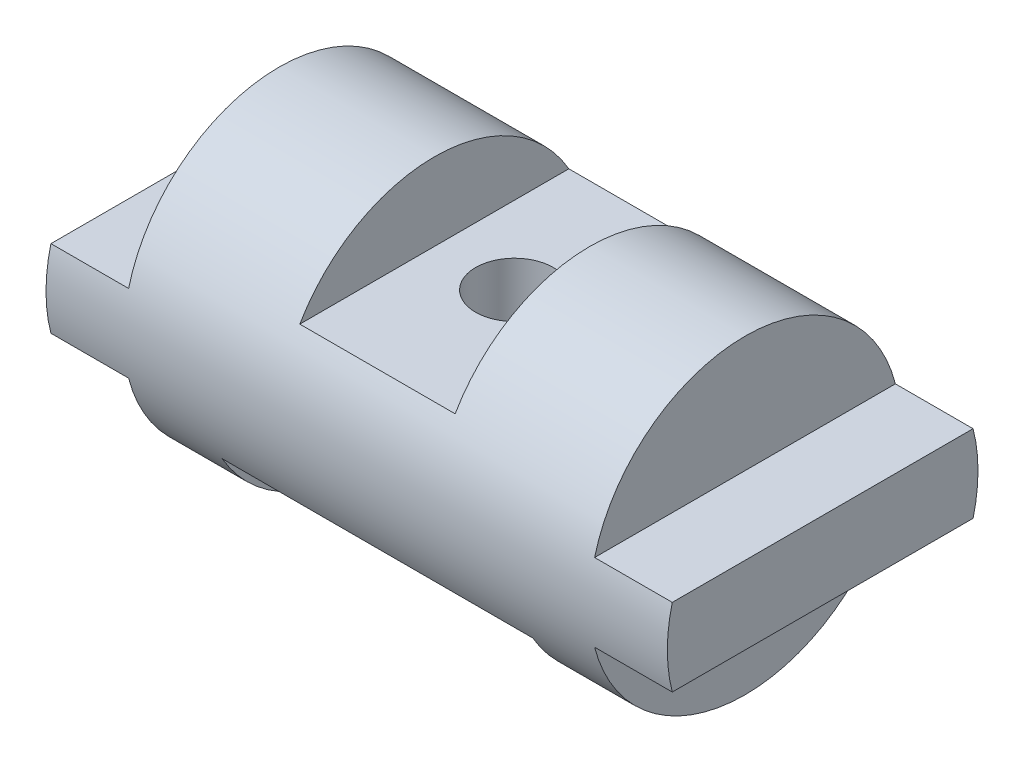
ISO-10303-21;
HEADER;
FILE_DESCRIPTION(('STEP AP214'),'2;1');
FILE_NAME('part.step','',(''),(''),'','','');
FILE_SCHEMA(('AUTOMOTIVE_DESIGN { 1 0 10303 214 1 1 1 1 }'));
ENDSEC;
DATA;
#1=APPLICATION_CONTEXT('core data for automotive mechanical design processes');
#2=APPLICATION_PROTOCOL_DEFINITION('international standard','automotive_design',2000,#1);
#3=PRODUCT_CONTEXT('',#1,'mechanical');
#4=PRODUCT('Part','Part','',(#3));
#5=PRODUCT_RELATED_PRODUCT_CATEGORY('part','',(#4));
#6=PRODUCT_DEFINITION_FORMATION('','',#4);
#7=PRODUCT_DEFINITION_CONTEXT('part definition',#1,'design');
#8=PRODUCT_DEFINITION('design','',#6,#7);
#9=PRODUCT_DEFINITION_SHAPE('','',#8);
#10=(LENGTH_UNIT() NAMED_UNIT(*) SI_UNIT(.MILLI.,.METRE.));
#11=(NAMED_UNIT(*) PLANE_ANGLE_UNIT() SI_UNIT($,.RADIAN.));
#12=(NAMED_UNIT(*) SI_UNIT($,.STERADIAN.) SOLID_ANGLE_UNIT());
#13=UNCERTAINTY_MEASURE_WITH_UNIT(LENGTH_MEASURE(1.E-05),#10,'distance_accuracy_value','');
#14=(GEOMETRIC_REPRESENTATION_CONTEXT(3) GLOBAL_UNCERTAINTY_ASSIGNED_CONTEXT((#13)) GLOBAL_UNIT_ASSIGNED_CONTEXT((#10,
#11,#12)) REPRESENTATION_CONTEXT('',''));
#15=CARTESIAN_POINT('',(0.,0.,0.));
#16=DIRECTION('',(0.,0.,1.));
#17=DIRECTION('',(1.,0.,0.));
#18=AXIS2_PLACEMENT_3D('',#15,#16,#17);
#19=CARTESIAN_POINT('',(30.,20.,20.001));
#20=DIRECTION('',(1.,0.,0.));
#21=DIRECTION('',(0.,0.,-1.));
#22=AXIS2_PLACEMENT_3D('',#19,#20,#21);
#23=PLANE('',#22);
#24=DIRECTION('',(0.,0.,-1.));
#25=VECTOR('',#24,1.);
#26=CARTESIAN_POINT('',(30.,10.,20.001));
#27=LINE('',#26,#25);
#28=CARTESIAN_POINT('',(30.,10.,17.3205080756888));
#29=VERTEX_POINT('',#28);
#30=CARTESIAN_POINT('',(30.,10.,-17.3205080756888));
#31=VERTEX_POINT('',#30);
#32=EDGE_CURVE('E210',#29,#31,#27,.T.);
#33=ORIENTED_EDGE('',*,*,#32,.T.);
#34=CARTESIAN_POINT('',(30.,0.,0.));
#35=DIRECTION('',(1.,0.,0.));
#36=DIRECTION('',(0.,0.,-1.));
#37=AXIS2_PLACEMENT_3D('',#34,#35,#36);
#38=CIRCLE('',#37,20.);
#39=EDGE_CURVE('E205',#29,#31,#38,.F.);
#40=ORIENTED_EDGE('',*,*,#39,.F.);
#41=EDGE_LOOP('',(#33,#40));
#42=FACE_BOUND('',#41,.T.);
#43=ADVANCED_FACE('F33',(#42),#23,.T.);
#44=CARTESIAN_POINT('',(30.,10.,20.001));
#45=DIRECTION('',(0.,1.,0.));
#46=DIRECTION('',(-1.,0.,0.));
#47=AXIS2_PLACEMENT_3D('',#44,#45,#46);
#48=PLANE('',#47);
#49=CARTESIAN_POINT('',(40.,10.,-0.320508075688761));
#50=DIRECTION('',(0.,1.,0.));
#51=DIRECTION('',(-1.,0.,0.));
#52=AXIS2_PLACEMENT_3D('',#49,#50,#51);
#53=CIRCLE('',#52,5.);
#54=CARTESIAN_POINT('',(35.,10.,-0.320508075688761));
#55=VERTEX_POINT('',#54);
#56=EDGE_CURVE('E138',#55,#55,#53,.T.);
#57=ORIENTED_EDGE('',*,*,#56,.F.);
#58=EDGE_LOOP('',(#57));
#59=FACE_BOUND('',#58,.T.);
#60=DIRECTION('',(0.,0.,-1.));
#61=VECTOR('',#60,1.);
#62=CARTESIAN_POINT('',(50.,10.,20.001));
#63=LINE('',#62,#61);
#64=CARTESIAN_POINT('',(50.,10.,17.3205080756888));
#65=VERTEX_POINT('',#64);
#66=CARTESIAN_POINT('',(50.,10.,-17.3205080756888));
#67=VERTEX_POINT('',#66);
#68=EDGE_CURVE('E208',#65,#67,#63,.T.);
#69=ORIENTED_EDGE('',*,*,#68,.T.);
#70=DIRECTION('',(-1.,0.,0.));
#71=VECTOR('',#70,1.);
#72=CARTESIAN_POINT('',(80.,10.,-17.3205080756888));
#73=LINE('',#72,#71);
#74=EDGE_CURVE('E161',#67,#31,#73,.T.);
#75=ORIENTED_EDGE('',*,*,#74,.T.);
#76=ORIENTED_EDGE('',*,*,#32,.F.);
#77=DIRECTION('',(-1.,0.,0.));
#78=VECTOR('',#77,1.);
#79=CARTESIAN_POINT('',(80.,10.,17.3205080756888));
#80=LINE('',#79,#78);
#81=EDGE_CURVE('E57',#65,#29,#80,.T.);
#82=ORIENTED_EDGE('',*,*,#81,.F.);
#83=EDGE_LOOP('',(#69,#75,#76,#82));
#84=FACE_BOUND('',#83,.T.);
#85=ADVANCED_FACE('F245',(#59,#84),#48,.T.);
#86=CARTESIAN_POINT('',(50.,10.,20.001));
#87=DIRECTION('',(-1.,0.,0.));
#88=DIRECTION('',(0.,-1.,0.));
#89=AXIS2_PLACEMENT_3D('',#86,#87,#88);
#90=PLANE('',#89);
#91=ORIENTED_EDGE('',*,*,#68,.F.);
#92=CARTESIAN_POINT('',(50.,0.,0.));
#93=DIRECTION('',(-1.,0.,0.));
#94=DIRECTION('',(0.,-1.,0.));
#95=AXIS2_PLACEMENT_3D('',#92,#93,#94);
#96=CIRCLE('',#95,20.);
#97=EDGE_CURVE('E201',#67,#65,#96,.F.);
#98=ORIENTED_EDGE('',*,*,#97,.F.);
#99=EDGE_LOOP('',(#91,#98));
#100=FACE_BOUND('',#99,.T.);
#101=ADVANCED_FACE('F251',(#100),#90,.T.);
#102=CARTESIAN_POINT('',(80.,0.,0.));
#103=DIRECTION('',(-1.,0.,0.));
#104=DIRECTION('',(0.,0.,1.));
#105=AXIS2_PLACEMENT_3D('',#102,#103,#104);
#106=CYLINDRICAL_SURFACE('',#105,20.);
#107=ORIENTED_EDGE('',*,*,#39,.T.);
#108=ORIENTED_EDGE('',*,*,#74,.F.);
#109=ORIENTED_EDGE('',*,*,#97,.T.);
#110=ORIENTED_EDGE('',*,*,#81,.T.);
#111=EDGE_LOOP('',(#107,#108,#109,#110));
#112=FACE_BOUND('',#111,.T.);
#113=CARTESIAN_POINT('',(60.,0.,0.));
#114=DIRECTION('',(-1.,0.,0.));
#115=DIRECTION('',(0.,-1.,0.));
#116=AXIS2_PLACEMENT_3D('',#113,#114,#115);
#117=CIRCLE('',#116,20.);
#118=CARTESIAN_POINT('',(60.,-9.99999999999999,17.3205080756888));
#119=VERTEX_POINT('',#118);
#120=CARTESIAN_POINT('',(60.,-9.99999999999999,-17.3205080756888));
#121=VERTEX_POINT('',#120);
#122=EDGE_CURVE('E128',#119,#121,#117,.F.);
#123=ORIENTED_EDGE('',*,*,#122,.T.);
#124=DIRECTION('',(-1.,0.,0.));
#125=VECTOR('',#124,1.);
#126=CARTESIAN_POINT('',(80.,-9.99999999999999,-17.3205080756888));
#127=LINE('',#126,#125);
#128=CARTESIAN_POINT('',(20.,-9.99999999999999,-17.3205080756888));
#129=VERTEX_POINT('',#128);
#130=EDGE_CURVE('E133',#129,#121,#127,.F.);
#131=ORIENTED_EDGE('',*,*,#130,.F.);
#132=CARTESIAN_POINT('',(20.,0.,0.));
#133=DIRECTION('',(1.,0.,0.));
#134=DIRECTION('',(0.,0.,-1.));
#135=AXIS2_PLACEMENT_3D('',#132,#133,#134);
#136=CIRCLE('',#135,20.);
#137=CARTESIAN_POINT('',(20.,-10.,17.3205080756888));
#138=VERTEX_POINT('',#137);
#139=EDGE_CURVE('E137',#129,#138,#136,.F.);
#140=ORIENTED_EDGE('',*,*,#139,.T.);
#141=DIRECTION('',(-1.,0.,0.));
#142=VECTOR('',#141,1.);
#143=CARTESIAN_POINT('',(80.,-9.99999999999999,17.3205080756888));
#144=LINE('',#143,#142);
#145=EDGE_CURVE('E49',#138,#119,#144,.F.);
#146=ORIENTED_EDGE('',*,*,#145,.T.);
#147=EDGE_LOOP('',(#123,#131,#140,#146));
#148=FACE_BOUND('',#147,.T.);
#149=DIRECTION('',(-1.,0.,0.));
#150=VECTOR('',#149,1.);
#151=CARTESIAN_POINT('',(80.,5.,-19.3649167310371));
#152=LINE('',#151,#150);
#153=CARTESIAN_POINT('',(80.,5.,-19.3649167310371));
#154=VERTEX_POINT('',#153);
#155=CARTESIAN_POINT('',(70.,5.,-19.3649167310371));
#156=VERTEX_POINT('',#155);
#157=EDGE_CURVE('E175',#154,#156,#152,.T.);
#158=ORIENTED_EDGE('',*,*,#157,.F.);
#159=CARTESIAN_POINT('',(80.,0.,0.));
#160=DIRECTION('',(1.,0.,0.));
#161=DIRECTION('',(0.,0.,-1.));
#162=AXIS2_PLACEMENT_3D('',#159,#160,#161);
#163=CIRCLE('',#162,20.);
#164=CARTESIAN_POINT('',(80.,-5.,-19.3649167310371));
#165=VERTEX_POINT('',#164);
#166=EDGE_CURVE('E42',#165,#154,#163,.T.);
#167=ORIENTED_EDGE('',*,*,#166,.F.);
#168=DIRECTION('',(-1.,0.,0.));
#169=VECTOR('',#168,1.);
#170=CARTESIAN_POINT('',(80.,-5.,-19.3649167310371));
#171=LINE('',#170,#169);
#172=CARTESIAN_POINT('',(70.,-5.,-19.3649167310371));
#173=VERTEX_POINT('',#172);
#174=EDGE_CURVE('E129',#173,#165,#171,.F.);
#175=ORIENTED_EDGE('',*,*,#174,.F.);
#176=CARTESIAN_POINT('',(70.,0.,0.));
#177=DIRECTION('',(1.,0.,0.));
#178=DIRECTION('',(0.,0.,-1.));
#179=AXIS2_PLACEMENT_3D('',#176,#177,#178);
#180=CIRCLE('',#179,20.);
#181=CARTESIAN_POINT('',(70.,-5.,19.3649167310371));
#182=VERTEX_POINT('',#181);
#183=EDGE_CURVE('E189',#173,#182,#180,.F.);
#184=ORIENTED_EDGE('',*,*,#183,.T.);
#185=DIRECTION('',(-1.,0.,0.));
#186=VECTOR('',#185,1.);
#187=CARTESIAN_POINT('',(80.,-5.,19.3649167310371));
#188=LINE('',#187,#186);
#189=CARTESIAN_POINT('',(80.,-5.,19.3649167310371));
#190=VERTEX_POINT('',#189);
#191=EDGE_CURVE('E192',#182,#190,#188,.F.);
#192=ORIENTED_EDGE('',*,*,#191,.T.);
#193=CARTESIAN_POINT('',(80.,5.,19.3649167310371));
#194=VERTEX_POINT('',#193);
#195=EDGE_CURVE('E11',#194,#190,#163,.T.);
#196=ORIENTED_EDGE('',*,*,#195,.F.);
#197=DIRECTION('',(-1.,0.,0.));
#198=VECTOR('',#197,1.);
#199=CARTESIAN_POINT('',(80.,5.,19.3649167310371));
#200=LINE('',#199,#198);
#201=CARTESIAN_POINT('',(70.,5.,19.3649167310371));
#202=VERTEX_POINT('',#201);
#203=EDGE_CURVE('E182',#194,#202,#200,.T.);
#204=ORIENTED_EDGE('',*,*,#203,.T.);
#205=CARTESIAN_POINT('',(70.,0.,0.));
#206=DIRECTION('',(1.,0.,0.));
#207=DIRECTION('',(0.,0.,-1.));
#208=AXIS2_PLACEMENT_3D('',#205,#206,#207);
#209=CIRCLE('',#208,20.);
#210=EDGE_CURVE('E178',#202,#156,#209,.F.);
#211=ORIENTED_EDGE('',*,*,#210,.T.);
#212=EDGE_LOOP('',(#158,#167,#175,#184,#192,#196,#204,#211));
#213=FACE_BOUND('',#212,.T.);
#214=DIRECTION('',(-1.,0.,0.));
#215=VECTOR('',#214,1.);
#216=CARTESIAN_POINT('',(80.,5.,-19.3649167310371));
#217=LINE('',#216,#215);
#218=CARTESIAN_POINT('',(9.99999999999999,5.,-19.3649167310371));
#219=VERTEX_POINT('',#218);
#220=CARTESIAN_POINT('',(0.,5.,-19.3649167310371));
#221=VERTEX_POINT('',#220);
#222=EDGE_CURVE('E146',#219,#221,#217,.T.);
#223=ORIENTED_EDGE('',*,*,#222,.F.);
#224=CARTESIAN_POINT('',(9.99999999999999,0.,0.));
#225=DIRECTION('',(-1.,0.,0.));
#226=DIRECTION('',(0.,0.,1.));
#227=AXIS2_PLACEMENT_3D('',#224,#225,#226);
#228=CIRCLE('',#227,20.);
#229=CARTESIAN_POINT('',(9.99999999999999,5.,19.3649167310371));
#230=VERTEX_POINT('',#229);
#231=EDGE_CURVE('E148',#219,#230,#228,.F.);
#232=ORIENTED_EDGE('',*,*,#231,.T.);
#233=DIRECTION('',(-1.,0.,0.));
#234=VECTOR('',#233,1.);
#235=CARTESIAN_POINT('',(80.,5.,19.3649167310371));
#236=LINE('',#235,#234);
#237=CARTESIAN_POINT('',(0.,5.,19.3649167310371));
#238=VERTEX_POINT('',#237);
#239=EDGE_CURVE('E152',#230,#238,#236,.T.);
#240=ORIENTED_EDGE('',*,*,#239,.T.);
#241=CARTESIAN_POINT('',(0.,0.,0.));
#242=DIRECTION('',(1.,0.,0.));
#243=DIRECTION('',(0.,0.,-1.));
#244=AXIS2_PLACEMENT_3D('',#241,#242,#243);
#245=CIRCLE('',#244,20.);
#246=CARTESIAN_POINT('',(0.,-5.,19.3649167310371));
#247=VERTEX_POINT('',#246);
#248=EDGE_CURVE('E212',#238,#247,#245,.T.);
#249=ORIENTED_EDGE('',*,*,#248,.T.);
#250=DIRECTION('',(-1.,0.,0.));
#251=VECTOR('',#250,1.);
#252=CARTESIAN_POINT('',(80.,-5.,19.3649167310371));
#253=LINE('',#252,#251);
#254=CARTESIAN_POINT('',(10.,-5.,19.3649167310371));
#255=VERTEX_POINT('',#254);
#256=EDGE_CURVE('E169',#247,#255,#253,.F.);
#257=ORIENTED_EDGE('',*,*,#256,.T.);
#258=CARTESIAN_POINT('',(9.99999999999999,0.,0.));
#259=DIRECTION('',(-1.,0.,0.));
#260=DIRECTION('',(0.,-1.,0.));
#261=AXIS2_PLACEMENT_3D('',#258,#259,#260);
#262=CIRCLE('',#261,20.);
#263=CARTESIAN_POINT('',(9.99999999999999,-5.,-19.3649167310371));
#264=VERTEX_POINT('',#263);
#265=EDGE_CURVE('E165',#255,#264,#262,.F.);
#266=ORIENTED_EDGE('',*,*,#265,.T.);
#267=DIRECTION('',(-1.,0.,0.));
#268=VECTOR('',#267,1.);
#269=CARTESIAN_POINT('',(80.,-5.,-19.3649167310371));
#270=LINE('',#269,#268);
#271=CARTESIAN_POINT('',(0.,-5.,-19.3649167310371));
#272=VERTEX_POINT('',#271);
#273=EDGE_CURVE('E162',#272,#264,#270,.F.);
#274=ORIENTED_EDGE('',*,*,#273,.F.);
#275=EDGE_CURVE('E37',#272,#221,#245,.T.);
#276=ORIENTED_EDGE('',*,*,#275,.T.);
#277=EDGE_LOOP('',(#223,#232,#240,#249,#257,#266,#274,#276));
#278=FACE_BOUND('',#277,.T.);
#279=ADVANCED_FACE('F35',(#112,#148,#213,#278),#106,.T.);
#280=CARTESIAN_POINT('',(80.,0.,0.));
#281=DIRECTION('',(1.,0.,0.));
#282=DIRECTION('',(0.,0.,-1.));
#283=AXIS2_PLACEMENT_3D('',#280,#281,#282);
#284=PLANE('',#283);
#285=ORIENTED_EDGE('',*,*,#166,.T.);
#286=DIRECTION('',(0.,0.,-1.));
#287=VECTOR('',#286,1.);
#288=CARTESIAN_POINT('',(80.,5.,20.001));
#289=LINE('',#288,#287);
#290=EDGE_CURVE('E185',#194,#154,#289,.T.);
#291=ORIENTED_EDGE('',*,*,#290,.F.);
#292=ORIENTED_EDGE('',*,*,#195,.T.);
#293=DIRECTION('',(0.,0.,-1.));
#294=VECTOR('',#293,1.);
#295=CARTESIAN_POINT('',(80.,-5.,20.001));
#296=LINE('',#295,#294);
#297=EDGE_CURVE('E179',#190,#165,#296,.T.);
#298=ORIENTED_EDGE('',*,*,#297,.T.);
#299=EDGE_LOOP('',(#285,#291,#292,#298));
#300=FACE_BOUND('',#299,.T.);
#301=ADVANCED_FACE('F256',(#300),#284,.T.);
#302=CARTESIAN_POINT('',(0.,0.,0.));
#303=DIRECTION('',(1.,0.,0.));
#304=DIRECTION('',(0.,0.,-1.));
#305=AXIS2_PLACEMENT_3D('',#302,#303,#304);
#306=PLANE('',#305);
#307=DIRECTION('',(0.,0.,-1.));
#308=VECTOR('',#307,1.);
#309=CARTESIAN_POINT('',(0.,5.,20.001));
#310=LINE('',#309,#308);
#311=EDGE_CURVE('E158',#238,#221,#310,.T.);
#312=ORIENTED_EDGE('',*,*,#311,.T.);
#313=ORIENTED_EDGE('',*,*,#275,.F.);
#314=DIRECTION('',(0.,0.,-1.));
#315=VECTOR('',#314,1.);
#316=CARTESIAN_POINT('',(0.,-5.,20.001));
#317=LINE('',#316,#315);
#318=EDGE_CURVE('E172',#247,#272,#317,.T.);
#319=ORIENTED_EDGE('',*,*,#318,.F.);
#320=ORIENTED_EDGE('',*,*,#248,.F.);
#321=EDGE_LOOP('',(#312,#313,#319,#320));
#322=FACE_BOUND('',#321,.T.);
#323=ADVANCED_FACE('F225',(#322),#306,.F.);
#324=CARTESIAN_POINT('',(10.,-5.,20.001));
#325=DIRECTION('',(-1.,0.,0.));
#326=DIRECTION('',(0.,-1.,0.));
#327=AXIS2_PLACEMENT_3D('',#324,#325,#326);
#328=PLANE('',#327);
#329=DIRECTION('',(0.,0.,-1.));
#330=VECTOR('',#329,1.);
#331=CARTESIAN_POINT('',(10.,-5.,20.001));
#332=LINE('',#331,#330);
#333=EDGE_CURVE('E149',#255,#264,#332,.T.);
#334=ORIENTED_EDGE('',*,*,#333,.T.);
#335=ORIENTED_EDGE('',*,*,#265,.F.);
#336=EDGE_LOOP('',(#334,#335));
#337=FACE_BOUND('',#336,.T.);
#338=ADVANCED_FACE('F259',(#337),#328,.T.);
#339=CARTESIAN_POINT('',(0.,-5.,20.001));
#340=DIRECTION('',(0.,-1.,0.));
#341=DIRECTION('',(0.,0.,-1.));
#342=AXIS2_PLACEMENT_3D('',#339,#340,#341);
#343=PLANE('',#342);
#344=ORIENTED_EDGE('',*,*,#318,.T.);
#345=ORIENTED_EDGE('',*,*,#273,.T.);
#346=ORIENTED_EDGE('',*,*,#333,.F.);
#347=ORIENTED_EDGE('',*,*,#256,.F.);
#348=EDGE_LOOP('',(#344,#345,#346,#347));
#349=FACE_BOUND('',#348,.T.);
#350=ADVANCED_FACE('F241',(#349),#343,.T.);
#351=CARTESIAN_POINT('',(0.,5.,20.001));
#352=DIRECTION('',(0.,1.,0.));
#353=DIRECTION('',(0.,0.,1.));
#354=AXIS2_PLACEMENT_3D('',#351,#352,#353);
#355=PLANE('',#354);
#356=DIRECTION('',(0.,0.,-1.));
#357=VECTOR('',#356,1.);
#358=CARTESIAN_POINT('',(10.,5.,20.001));
#359=LINE('',#358,#357);
#360=EDGE_CURVE('E155',#230,#219,#359,.T.);
#361=ORIENTED_EDGE('',*,*,#360,.T.);
#362=ORIENTED_EDGE('',*,*,#222,.T.);
#363=ORIENTED_EDGE('',*,*,#311,.F.);
#364=ORIENTED_EDGE('',*,*,#239,.F.);
#365=EDGE_LOOP('',(#361,#362,#363,#364));
#366=FACE_BOUND('',#365,.T.);
#367=ADVANCED_FACE('F228',(#366),#355,.T.);
#368=CARTESIAN_POINT('',(10.,5.,20.001));
#369=DIRECTION('',(-1.,0.,0.));
#370=DIRECTION('',(0.,0.,1.));
#371=AXIS2_PLACEMENT_3D('',#368,#369,#370);
#372=PLANE('',#371);
#373=ORIENTED_EDGE('',*,*,#360,.F.);
#374=ORIENTED_EDGE('',*,*,#231,.F.);
#375=EDGE_LOOP('',(#373,#374));
#376=FACE_BOUND('',#375,.T.);
#377=ADVANCED_FACE('F230',(#376),#372,.T.);
#378=CARTESIAN_POINT('',(70.,-20.,20.001));
#379=DIRECTION('',(1.,0.,0.));
#380=DIRECTION('',(0.,0.,-1.));
#381=AXIS2_PLACEMENT_3D('',#378,#379,#380);
#382=PLANE('',#381);
#383=DIRECTION('',(0.,0.,-1.));
#384=VECTOR('',#383,1.);
#385=CARTESIAN_POINT('',(70.,-5.,20.001));
#386=LINE('',#385,#384);
#387=EDGE_CURVE('E195',#182,#173,#386,.T.);
#388=ORIENTED_EDGE('',*,*,#387,.F.);
#389=ORIENTED_EDGE('',*,*,#183,.F.);
#390=EDGE_LOOP('',(#388,#389));
#391=FACE_BOUND('',#390,.T.);
#392=ADVANCED_FACE('F232',(#391),#382,.T.);
#393=CARTESIAN_POINT('',(70.,-5.,20.001));
#394=DIRECTION('',(0.,-1.,0.));
#395=DIRECTION('',(0.,0.,-1.));
#396=AXIS2_PLACEMENT_3D('',#393,#394,#395);
#397=PLANE('',#396);
#398=ORIENTED_EDGE('',*,*,#387,.T.);
#399=ORIENTED_EDGE('',*,*,#174,.T.);
#400=ORIENTED_EDGE('',*,*,#297,.F.);
#401=ORIENTED_EDGE('',*,*,#191,.F.);
#402=EDGE_LOOP('',(#398,#399,#400,#401));
#403=FACE_BOUND('',#402,.T.);
#404=ADVANCED_FACE('F238',(#403),#397,.T.);
#405=CARTESIAN_POINT('',(70.,20.,20.001));
#406=DIRECTION('',(1.,0.,0.));
#407=DIRECTION('',(0.,0.,-1.));
#408=AXIS2_PLACEMENT_3D('',#405,#406,#407);
#409=PLANE('',#408);
#410=DIRECTION('',(0.,0.,-1.));
#411=VECTOR('',#410,1.);
#412=CARTESIAN_POINT('',(70.,5.,20.001));
#413=LINE('',#412,#411);
#414=EDGE_CURVE('E166',#202,#156,#413,.T.);
#415=ORIENTED_EDGE('',*,*,#414,.T.);
#416=ORIENTED_EDGE('',*,*,#210,.F.);
#417=EDGE_LOOP('',(#415,#416));
#418=FACE_BOUND('',#417,.T.);
#419=ADVANCED_FACE('F274',(#418),#409,.T.);
#420=CARTESIAN_POINT('',(70.,5.,20.001));
#421=DIRECTION('',(0.,1.,0.));
#422=DIRECTION('',(0.,0.,1.));
#423=AXIS2_PLACEMENT_3D('',#420,#421,#422);
#424=PLANE('',#423);
#425=ORIENTED_EDGE('',*,*,#290,.T.);
#426=ORIENTED_EDGE('',*,*,#157,.T.);
#427=ORIENTED_EDGE('',*,*,#414,.F.);
#428=ORIENTED_EDGE('',*,*,#203,.F.);
#429=EDGE_LOOP('',(#425,#426,#427,#428));
#430=FACE_BOUND('',#429,.T.);
#431=ADVANCED_FACE('F271',(#430),#424,.T.);
#432=CARTESIAN_POINT('',(60.,-9.99999999999999,20.001));
#433=DIRECTION('',(-1.,0.,0.));
#434=DIRECTION('',(0.,-1.,0.));
#435=AXIS2_PLACEMENT_3D('',#432,#433,#434);
#436=PLANE('',#435);
#437=DIRECTION('',(0.,0.,-1.));
#438=VECTOR('',#437,1.);
#439=CARTESIAN_POINT('',(60.,-9.99999999999999,20.001));
#440=LINE('',#439,#438);
#441=EDGE_CURVE('E124',#119,#121,#440,.T.);
#442=ORIENTED_EDGE('',*,*,#441,.T.);
#443=ORIENTED_EDGE('',*,*,#122,.F.);
#444=EDGE_LOOP('',(#442,#443));
#445=FACE_BOUND('',#444,.T.);
#446=ADVANCED_FACE('F126',(#445),#436,.T.);
#447=CARTESIAN_POINT('',(20.,-10.,20.001));
#448=DIRECTION('',(0.,-1.,0.));
#449=DIRECTION('',(1.,0.,0.));
#450=AXIS2_PLACEMENT_3D('',#447,#448,#449);
#451=PLANE('',#450);
#452=CARTESIAN_POINT('',(40.,-10.,-0.320508075688761));
#453=DIRECTION('',(0.,-1.,0.));
#454=DIRECTION('',(1.,0.,0.));
#455=AXIS2_PLACEMENT_3D('',#452,#453,#454);
#456=CIRCLE('',#455,5.);
#457=CARTESIAN_POINT('',(45.,-10.,-0.320508075688761));
#458=VERTEX_POINT('',#457);
#459=EDGE_CURVE('E394',#458,#458,#456,.F.);
#460=ORIENTED_EDGE('',*,*,#459,.T.);
#461=EDGE_LOOP('',(#460));
#462=FACE_BOUND('',#461,.T.);
#463=DIRECTION('',(0.,0.,-1.));
#464=VECTOR('',#463,1.);
#465=CARTESIAN_POINT('',(20.,-10.,20.001));
#466=LINE('',#465,#464);
#467=EDGE_CURVE('E130',#138,#129,#466,.T.);
#468=ORIENTED_EDGE('',*,*,#467,.T.);
#469=ORIENTED_EDGE('',*,*,#130,.T.);
#470=ORIENTED_EDGE('',*,*,#441,.F.);
#471=ORIENTED_EDGE('',*,*,#145,.F.);
#472=EDGE_LOOP('',(#468,#469,#470,#471));
#473=FACE_BOUND('',#472,.T.);
#474=ADVANCED_FACE('F134',(#462,#473),#451,.T.);
#475=CARTESIAN_POINT('',(20.,-20.,20.001));
#476=DIRECTION('',(1.,0.,0.));
#477=DIRECTION('',(0.,0.,-1.));
#478=AXIS2_PLACEMENT_3D('',#475,#476,#477);
#479=PLANE('',#478);
#480=ORIENTED_EDGE('',*,*,#467,.F.);
#481=ORIENTED_EDGE('',*,*,#139,.F.);
#482=EDGE_LOOP('',(#480,#481));
#483=FACE_BOUND('',#482,.T.);
#484=ADVANCED_FACE('F358',(#483),#479,.T.);
#485=CARTESIAN_POINT('',(40.,-20.001,-0.320508075688761));
#486=DIRECTION('',(0.,1.,0.));
#487=DIRECTION('',(-1.,0.,0.));
#488=AXIS2_PLACEMENT_3D('',#485,#486,#487);
#489=CYLINDRICAL_SURFACE('',#488,5.);
#490=ORIENTED_EDGE('',*,*,#459,.F.);
#491=EDGE_LOOP('',(#490));
#492=FACE_BOUND('',#491,.T.);
#493=ORIENTED_EDGE('',*,*,#56,.T.);
#494=EDGE_LOOP('',(#493));
#495=FACE_BOUND('',#494,.T.);
#496=ADVANCED_FACE('F363',(#492,#495),#489,.F.);
#497=CLOSED_SHELL('',(#43,#85,#101,#279,#301,#323,#338,#350,#367,#377,#392,#404,#419,#431,#446,
#474,#484,#496));
#498=MANIFOLD_SOLID_BREP('B2',#497);
#499=ADVANCED_BREP_SHAPE_REPRESENTATION('',(#18,#498),#14);
#500=SHAPE_DEFINITION_REPRESENTATION(#9,#499);
ENDSEC;
END-ISO-10303-21;
